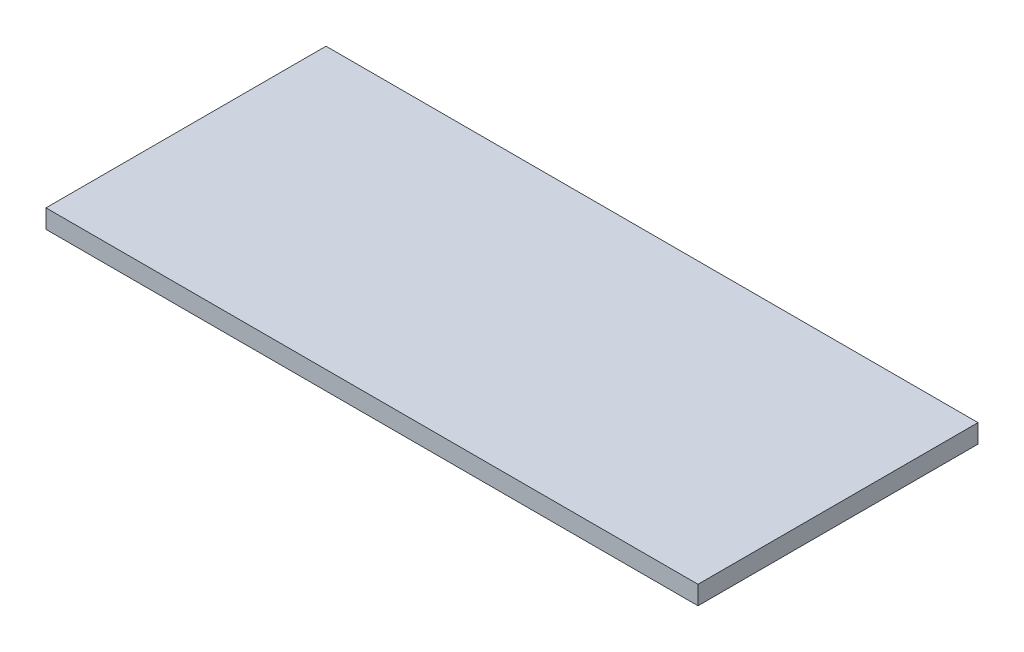
ISO-10303-21;
HEADER;
FILE_DESCRIPTION(('STEP AP214'),'2;1');
FILE_NAME('part.step','',(''),(''),'','','');
FILE_SCHEMA(('AUTOMOTIVE_DESIGN { 1 0 10303 214 1 1 1 1 }'));
ENDSEC;
DATA;
#1=APPLICATION_CONTEXT('core data for automotive mechanical design processes');
#2=APPLICATION_PROTOCOL_DEFINITION('international standard','automotive_design',2000,#1);
#3=PRODUCT_CONTEXT('',#1,'mechanical');
#4=PRODUCT('Part','Part','',(#3));
#5=PRODUCT_RELATED_PRODUCT_CATEGORY('part','',(#4));
#6=PRODUCT_DEFINITION_FORMATION('','',#4);
#7=PRODUCT_DEFINITION_CONTEXT('part definition',#1,'design');
#8=PRODUCT_DEFINITION('design','',#6,#7);
#9=PRODUCT_DEFINITION_SHAPE('','',#8);
#10=(LENGTH_UNIT() NAMED_UNIT(*) SI_UNIT(.MILLI.,.METRE.));
#11=(NAMED_UNIT(*) PLANE_ANGLE_UNIT() SI_UNIT($,.RADIAN.));
#12=(NAMED_UNIT(*) SI_UNIT($,.STERADIAN.) SOLID_ANGLE_UNIT());
#13=UNCERTAINTY_MEASURE_WITH_UNIT(LENGTH_MEASURE(1.E-05),#10,'distance_accuracy_value','');
#14=(GEOMETRIC_REPRESENTATION_CONTEXT(3) GLOBAL_UNCERTAINTY_ASSIGNED_CONTEXT((#13)) GLOBAL_UNIT_ASSIGNED_CONTEXT((#10,
#11,#12)) REPRESENTATION_CONTEXT('',''));
#15=CARTESIAN_POINT('',(0.,0.,0.));
#16=DIRECTION('',(0.,0.,1.));
#17=DIRECTION('',(1.,0.,0.));
#18=AXIS2_PLACEMENT_3D('',#15,#16,#17);
#19=CARTESIAN_POINT('',(18.9269908169872,2.,10.));
#20=DIRECTION('',(0.,0.,1.));
#21=DIRECTION('',(0.,-1.,0.));
#22=AXIS2_PLACEMENT_3D('',#19,#20,#21);
#23=PLANE('',#22);
#24=DIRECTION('',(1.,0.,0.));
#25=VECTOR('',#24,1.);
#26=CARTESIAN_POINT('',(19.9269908169872,0.,10.));
#27=LINE('',#26,#25);
#28=CARTESIAN_POINT('',(0.,0.,10.));
#29=VERTEX_POINT('',#28);
#30=CARTESIAN_POINT('',(34.9269908169872,0.,10.));
#31=VERTEX_POINT('',#30);
#32=EDGE_CURVE('E117',#29,#31,#27,.T.);
#33=ORIENTED_EDGE('',*,*,#32,.F.);
#34=DIRECTION('',(0.,1.,0.));
#35=VECTOR('',#34,1.);
#36=CARTESIAN_POINT('',(0.,-1.,10.));
#37=LINE('',#36,#35);
#38=CARTESIAN_POINT('',(0.,-1.,10.));
#39=VERTEX_POINT('',#38);
#40=EDGE_CURVE('E104',#39,#29,#37,.T.);
#41=ORIENTED_EDGE('',*,*,#40,.F.);
#42=DIRECTION('',(1.,0.,0.));
#43=VECTOR('',#42,1.);
#44=CARTESIAN_POINT('',(19.9269908169872,-1.,10.));
#45=LINE('',#44,#43);
#46=CARTESIAN_POINT('',(34.9269908169872,-1.,10.));
#47=VERTEX_POINT('',#46);
#48=EDGE_CURVE('E68',#39,#47,#45,.T.);
#49=ORIENTED_EDGE('',*,*,#48,.T.);
#50=DIRECTION('',(0.,-1.,0.));
#51=VECTOR('',#50,1.);
#52=CARTESIAN_POINT('',(34.9269908169872,0.,10.));
#53=LINE('',#52,#51);
#54=EDGE_CURVE('E111',#31,#47,#53,.T.);
#55=ORIENTED_EDGE('',*,*,#54,.F.);
#56=EDGE_LOOP('',(#33,#41,#49,#55));
#57=FACE_BOUND('',#56,.T.);
#58=ADVANCED_FACE('F44',(#57),#23,.T.);
#59=CARTESIAN_POINT('',(19.9269908169872,-1.,10.));
#60=DIRECTION('',(0.,1.,0.));
#61=DIRECTION('',(0.,0.,1.));
#62=AXIS2_PLACEMENT_3D('',#59,#60,#61);
#63=PLANE('',#62);
#64=ORIENTED_EDGE('',*,*,#48,.F.);
#65=DIRECTION('',(0.,0.,-1.));
#66=VECTOR('',#65,1.);
#67=CARTESIAN_POINT('',(0.,-1.,10.));
#68=LINE('',#67,#66);
#69=CARTESIAN_POINT('',(0.,-1.,-5.));
#70=VERTEX_POINT('',#69);
#71=EDGE_CURVE('E94',#39,#70,#68,.T.);
#72=ORIENTED_EDGE('',*,*,#71,.T.);
#73=DIRECTION('',(1.,0.,0.));
#74=VECTOR('',#73,1.);
#75=CARTESIAN_POINT('',(19.9269908169872,-1.,-5.));
#76=LINE('',#75,#74);
#77=CARTESIAN_POINT('',(34.9269908169872,-1.,-5.));
#78=VERTEX_POINT('',#77);
#79=EDGE_CURVE('E88',#70,#78,#76,.T.);
#80=ORIENTED_EDGE('',*,*,#79,.T.);
#81=DIRECTION('',(0.,0.,-1.));
#82=VECTOR('',#81,1.);
#83=CARTESIAN_POINT('',(34.9269908169872,-1.,10.));
#84=LINE('',#83,#82);
#85=EDGE_CURVE('E12',#47,#78,#84,.T.);
#86=ORIENTED_EDGE('',*,*,#85,.F.);
#87=EDGE_LOOP('',(#64,#72,#80,#86));
#88=FACE_BOUND('',#87,.T.);
#89=ADVANCED_FACE('F100',(#88),#63,.F.);
#90=CARTESIAN_POINT('',(34.9269908169872,0.,10.));
#91=DIRECTION('',(1.,0.,0.));
#92=DIRECTION('',(0.,0.,1.));
#93=AXIS2_PLACEMENT_3D('',#90,#91,#92);
#94=PLANE('',#93);
#95=ORIENTED_EDGE('',*,*,#85,.T.);
#96=DIRECTION('',(0.,-1.,0.));
#97=VECTOR('',#96,1.);
#98=CARTESIAN_POINT('',(34.9269908169872,0.,-5.));
#99=LINE('',#98,#97);
#100=CARTESIAN_POINT('',(34.9269908169872,0.,-5.));
#101=VERTEX_POINT('',#100);
#102=EDGE_CURVE('E95',#101,#78,#99,.T.);
#103=ORIENTED_EDGE('',*,*,#102,.F.);
#104=DIRECTION('',(0.,0.,-1.));
#105=VECTOR('',#104,1.);
#106=CARTESIAN_POINT('',(34.9269908169872,0.,10.));
#107=LINE('',#106,#105);
#108=EDGE_CURVE('E52',#31,#101,#107,.T.);
#109=ORIENTED_EDGE('',*,*,#108,.F.);
#110=ORIENTED_EDGE('',*,*,#54,.T.);
#111=EDGE_LOOP('',(#95,#103,#109,#110));
#112=FACE_BOUND('',#111,.T.);
#113=ADVANCED_FACE('F119',(#112),#94,.T.);
#114=CARTESIAN_POINT('',(0.,0.,10.));
#115=DIRECTION('',(0.,1.,0.));
#116=DIRECTION('',(0.,0.,1.));
#117=AXIS2_PLACEMENT_3D('',#114,#115,#116);
#118=PLANE('',#117);
#119=ORIENTED_EDGE('',*,*,#108,.T.);
#120=DIRECTION('',(1.,0.,0.));
#121=VECTOR('',#120,1.);
#122=CARTESIAN_POINT('',(19.9269908169872,0.,-5.));
#123=LINE('',#122,#121);
#124=CARTESIAN_POINT('',(0.,0.,-5.));
#125=VERTEX_POINT('',#124);
#126=EDGE_CURVE('E112',#125,#101,#123,.T.);
#127=ORIENTED_EDGE('',*,*,#126,.F.);
#128=DIRECTION('',(0.,0.,-1.));
#129=VECTOR('',#128,1.);
#130=CARTESIAN_POINT('',(0.,0.,10.));
#131=LINE('',#130,#129);
#132=EDGE_CURVE('E102',#29,#125,#131,.T.);
#133=ORIENTED_EDGE('',*,*,#132,.F.);
#134=ORIENTED_EDGE('',*,*,#32,.T.);
#135=EDGE_LOOP('',(#119,#127,#133,#134));
#136=FACE_BOUND('',#135,.T.);
#137=ADVANCED_FACE('F50',(#136),#118,.T.);
#138=CARTESIAN_POINT('',(21.9269908169872,2.,-5.));
#139=DIRECTION('',(0.,0.,-1.));
#140=DIRECTION('',(0.,1.,0.));
#141=AXIS2_PLACEMENT_3D('',#138,#139,#140);
#142=PLANE('',#141);
#143=ORIENTED_EDGE('',*,*,#79,.F.);
#144=DIRECTION('',(0.,1.,0.));
#145=VECTOR('',#144,1.);
#146=CARTESIAN_POINT('',(0.,-1.,-5.));
#147=LINE('',#146,#145);
#148=EDGE_CURVE('E93',#70,#125,#147,.T.);
#149=ORIENTED_EDGE('',*,*,#148,.T.);
#150=ORIENTED_EDGE('',*,*,#126,.T.);
#151=ORIENTED_EDGE('',*,*,#102,.T.);
#152=EDGE_LOOP('',(#143,#149,#150,#151));
#153=FACE_BOUND('',#152,.T.);
#154=ADVANCED_FACE('F86',(#153),#142,.T.);
#155=CARTESIAN_POINT('',(0.,-1.,10.));
#156=DIRECTION('',(-1.,0.,0.));
#157=DIRECTION('',(0.,0.,1.));
#158=AXIS2_PLACEMENT_3D('',#155,#156,#157);
#159=PLANE('',#158);
#160=ORIENTED_EDGE('',*,*,#132,.T.);
#161=ORIENTED_EDGE('',*,*,#148,.F.);
#162=ORIENTED_EDGE('',*,*,#71,.F.);
#163=ORIENTED_EDGE('',*,*,#40,.T.);
#164=EDGE_LOOP('',(#160,#161,#162,#163));
#165=FACE_BOUND('',#164,.T.);
#166=ADVANCED_FACE('F105',(#165),#159,.T.);
#167=CLOSED_SHELL('',(#58,#89,#113,#137,#154,#166));
#168=MANIFOLD_SOLID_BREP('B2',#167);
#169=ADVANCED_BREP_SHAPE_REPRESENTATION('',(#18,#168),#14);
#170=SHAPE_DEFINITION_REPRESENTATION(#9,#169);
ENDSEC;
END-ISO-10303-21;
